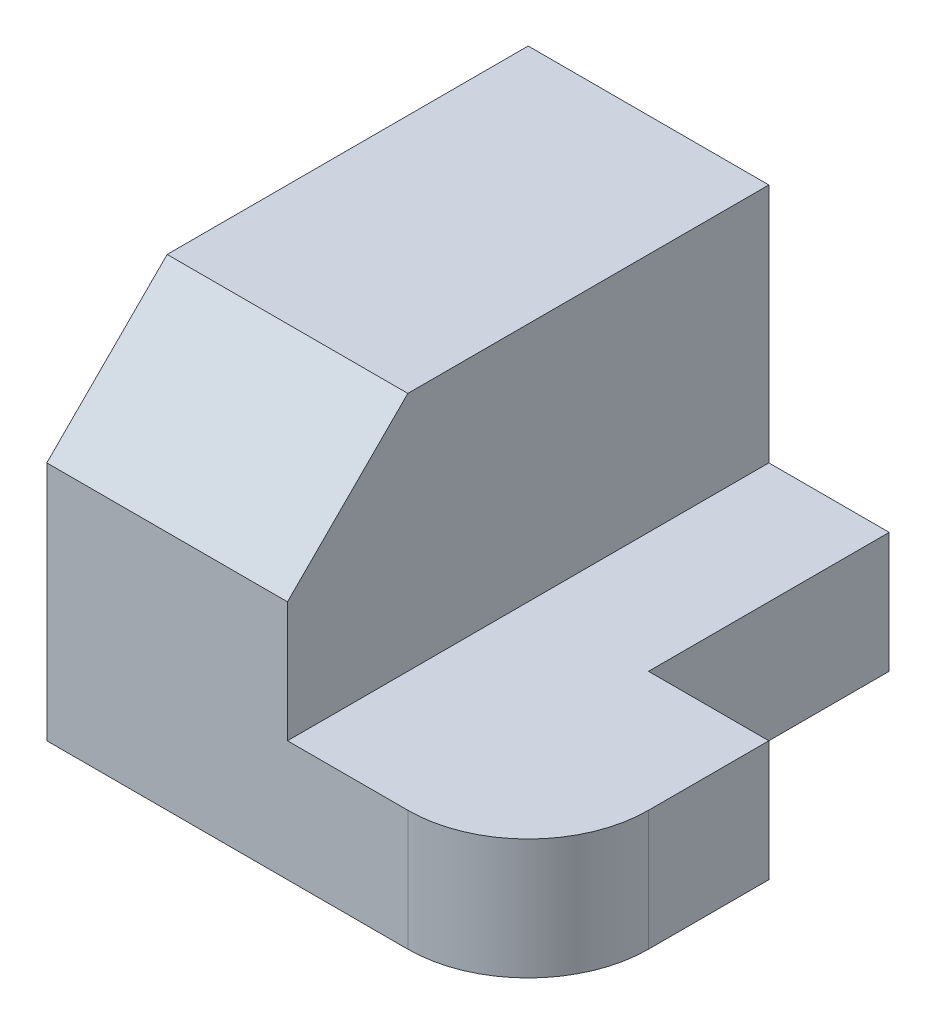
ISO-10303-21;
HEADER;
FILE_DESCRIPTION(('STEP AP214'),'2;1');
FILE_NAME('part.step','',(''),(''),'','','');
FILE_SCHEMA(('AUTOMOTIVE_DESIGN { 1 0 10303 214 1 1 1 1 }'));
ENDSEC;
DATA;
#1=APPLICATION_CONTEXT('core data for automotive mechanical design processes');
#2=APPLICATION_PROTOCOL_DEFINITION('international standard','automotive_design',2000,#1);
#3=PRODUCT_CONTEXT('',#1,'mechanical');
#4=PRODUCT('Part','Part','',(#3));
#5=PRODUCT_RELATED_PRODUCT_CATEGORY('part','',(#4));
#6=PRODUCT_DEFINITION_FORMATION('','',#4);
#7=PRODUCT_DEFINITION_CONTEXT('part definition',#1,'design');
#8=PRODUCT_DEFINITION('design','',#6,#7);
#9=PRODUCT_DEFINITION_SHAPE('','',#8);
#10=(LENGTH_UNIT() NAMED_UNIT(*) SI_UNIT(.MILLI.,.METRE.));
#11=(NAMED_UNIT(*) PLANE_ANGLE_UNIT() SI_UNIT($,.RADIAN.));
#12=(NAMED_UNIT(*) SI_UNIT($,.STERADIAN.) SOLID_ANGLE_UNIT());
#13=UNCERTAINTY_MEASURE_WITH_UNIT(LENGTH_MEASURE(1.E-05),#10,'distance_accuracy_value','');
#14=(GEOMETRIC_REPRESENTATION_CONTEXT(3) GLOBAL_UNCERTAINTY_ASSIGNED_CONTEXT((#13)) GLOBAL_UNIT_ASSIGNED_CONTEXT((#10,
#11,#12)) REPRESENTATION_CONTEXT('',''));
#15=CARTESIAN_POINT('',(0.,0.,0.));
#16=DIRECTION('',(0.,0.,1.));
#17=DIRECTION('',(1.,0.,0.));
#18=AXIS2_PLACEMENT_3D('',#15,#16,#17);
#19=CARTESIAN_POINT('',(-43.7606837606838,30.,25.6410256410256));
#20=DIRECTION('',(0.,0.,-1.));
#21=DIRECTION('',(-1.,0.,0.));
#22=AXIS2_PLACEMENT_3D('',#19,#20,#21);
#23=PLANE('',#22);
#24=DIRECTION('',(0.,1.,0.));
#25=VECTOR('',#24,1.);
#26=CARTESIAN_POINT('',(-23.7606837606837,10.,25.6410256410256));
#27=LINE('',#26,#25);
#28=CARTESIAN_POINT('',(-23.7606837606837,10.,25.6410256410256));
#29=VERTEX_POINT('',#28);
#30=CARTESIAN_POINT('',(-23.7606837606837,20.,25.6410256410256));
#31=VERTEX_POINT('',#30);
#32=EDGE_CURVE('E141',#29,#31,#27,.T.);
#33=ORIENTED_EDGE('',*,*,#32,.T.);
#34=DIRECTION('',(-1.,0.,0.));
#35=VECTOR('',#34,1.);
#36=CARTESIAN_POINT('',(-23.7606837606838,20.,25.6410256410256));
#37=LINE('',#36,#35);
#38=CARTESIAN_POINT('',(-43.7606837606838,20.,25.6410256410256));
#39=VERTEX_POINT('',#38);
#40=EDGE_CURVE('E56',#31,#39,#37,.T.);
#41=ORIENTED_EDGE('',*,*,#40,.T.);
#42=DIRECTION('',(0.,-1.,0.));
#43=VECTOR('',#42,1.);
#44=CARTESIAN_POINT('',(-43.7606837606838,30.,25.6410256410256));
#45=LINE('',#44,#43);
#46=CARTESIAN_POINT('',(-43.7606837606838,0.,25.6410256410256));
#47=VERTEX_POINT('',#46);
#48=EDGE_CURVE('E49',#39,#47,#45,.T.);
#49=ORIENTED_EDGE('',*,*,#48,.T.);
#50=DIRECTION('',(1.,0.,0.));
#51=VECTOR('',#50,1.);
#52=CARTESIAN_POINT('',(-43.7606837606838,0.,25.6410256410256));
#53=LINE('',#52,#51);
#54=CARTESIAN_POINT('',(-13.7606837606838,0.,25.6410256410256));
#55=VERTEX_POINT('',#54);
#56=EDGE_CURVE('E175',#47,#55,#53,.T.);
#57=ORIENTED_EDGE('',*,*,#56,.T.);
#58=DIRECTION('',(0.,-1.,0.));
#59=VECTOR('',#58,1.);
#60=CARTESIAN_POINT('',(-13.7606837606838,30.,25.6410256410256));
#61=LINE('',#60,#59);
#62=CARTESIAN_POINT('',(-13.7606837606838,10.,25.6410256410256));
#63=VERTEX_POINT('',#62);
#64=EDGE_CURVE('E212',#63,#55,#61,.T.);
#65=ORIENTED_EDGE('',*,*,#64,.F.);
#66=DIRECTION('',(1.,0.,0.));
#67=VECTOR('',#66,1.);
#68=CARTESIAN_POINT('',(-43.7606837606838,10.,25.6410256410256));
#69=LINE('',#68,#67);
#70=EDGE_CURVE('E161',#29,#63,#69,.T.);
#71=ORIENTED_EDGE('',*,*,#70,.F.);
#72=EDGE_LOOP('',(#33,#41,#49,#57,#65,#71));
#73=FACE_BOUND('',#72,.T.);
#74=ADVANCED_FACE('F40',(#73),#23,.F.);
#75=CARTESIAN_POINT('',(-13.7606837606838,30.,15.6410256410256));
#76=DIRECTION('',(0.,-1.,0.));
#77=DIRECTION('',(0.,0.,-1.));
#78=AXIS2_PLACEMENT_3D('',#75,#76,#77);
#79=CYLINDRICAL_SURFACE('',#78,10.);
#80=CARTESIAN_POINT('',(-13.7606837606838,10.,15.6410256410256));
#81=DIRECTION('',(0.,1.,0.));
#82=DIRECTION('',(0.,0.,1.));
#83=AXIS2_PLACEMENT_3D('',#80,#81,#82);
#84=CIRCLE('',#83,10.);
#85=CARTESIAN_POINT('',(-3.76068376068375,10.,15.6410256410256));
#86=VERTEX_POINT('',#85);
#87=EDGE_CURVE('E158',#63,#86,#84,.T.);
#88=ORIENTED_EDGE('',*,*,#87,.F.);
#89=ORIENTED_EDGE('',*,*,#64,.T.);
#90=CARTESIAN_POINT('',(-13.7606837606838,0.,15.6410256410256));
#91=DIRECTION('',(0.,1.,0.));
#92=DIRECTION('',(0.,0.,1.));
#93=AXIS2_PLACEMENT_3D('',#90,#91,#92);
#94=CIRCLE('',#93,10.);
#95=CARTESIAN_POINT('',(-3.76068376068375,0.,15.6410256410256));
#96=VERTEX_POINT('',#95);
#97=EDGE_CURVE('E179',#55,#96,#94,.T.);
#98=ORIENTED_EDGE('',*,*,#97,.T.);
#99=DIRECTION('',(0.,-1.,0.));
#100=VECTOR('',#99,1.);
#101=CARTESIAN_POINT('',(-3.76068376068375,30.,15.6410256410256));
#102=LINE('',#101,#100);
#103=EDGE_CURVE('E209',#86,#96,#102,.T.);
#104=ORIENTED_EDGE('',*,*,#103,.F.);
#105=EDGE_LOOP('',(#88,#89,#98,#104));
#106=FACE_BOUND('',#105,.T.);
#107=ADVANCED_FACE('F247',(#106),#79,.T.);
#108=CARTESIAN_POINT('',(-3.76068376068375,30.,15.6410256410256));
#109=DIRECTION('',(-1.,0.,0.));
#110=DIRECTION('',(0.,0.,1.));
#111=AXIS2_PLACEMENT_3D('',#108,#109,#110);
#112=PLANE('',#111);
#113=DIRECTION('',(0.,0.,-1.));
#114=VECTOR('',#113,1.);
#115=CARTESIAN_POINT('',(-3.76068376068375,10.,15.6410256410256));
#116=LINE('',#115,#114);
#117=CARTESIAN_POINT('',(-3.76068376068375,10.,5.64102564102564));
#118=VERTEX_POINT('',#117);
#119=EDGE_CURVE('E155',#86,#118,#116,.T.);
#120=ORIENTED_EDGE('',*,*,#119,.F.);
#121=ORIENTED_EDGE('',*,*,#103,.T.);
#122=DIRECTION('',(0.,0.,-1.));
#123=VECTOR('',#122,1.);
#124=CARTESIAN_POINT('',(-3.76068376068375,0.,15.6410256410256));
#125=LINE('',#124,#123);
#126=CARTESIAN_POINT('',(-3.76068376068375,0.,5.64102564102564));
#127=VERTEX_POINT('',#126);
#128=EDGE_CURVE('E183',#96,#127,#125,.T.);
#129=ORIENTED_EDGE('',*,*,#128,.T.);
#130=DIRECTION('',(0.,-1.,0.));
#131=VECTOR('',#130,1.);
#132=CARTESIAN_POINT('',(-3.76068376068375,30.,5.64102564102564));
#133=LINE('',#132,#131);
#134=EDGE_CURVE('E206',#118,#127,#133,.T.);
#135=ORIENTED_EDGE('',*,*,#134,.F.);
#136=EDGE_LOOP('',(#120,#121,#129,#135));
#137=FACE_BOUND('',#136,.T.);
#138=ADVANCED_FACE('F243',(#137),#112,.F.);
#139=CARTESIAN_POINT('',(-3.76068376068375,30.,5.64102564102564));
#140=DIRECTION('',(0.,0.,1.));
#141=DIRECTION('',(1.,0.,0.));
#142=AXIS2_PLACEMENT_3D('',#139,#140,#141);
#143=PLANE('',#142);
#144=DIRECTION('',(-1.,0.,0.));
#145=VECTOR('',#144,1.);
#146=CARTESIAN_POINT('',(-3.76068376068375,10.,5.64102564102564));
#147=LINE('',#146,#145);
#148=CARTESIAN_POINT('',(-13.7606837606838,10.,5.64102564102564));
#149=VERTEX_POINT('',#148);
#150=EDGE_CURVE('E152',#118,#149,#147,.T.);
#151=ORIENTED_EDGE('',*,*,#150,.F.);
#152=ORIENTED_EDGE('',*,*,#134,.T.);
#153=DIRECTION('',(-1.,0.,0.));
#154=VECTOR('',#153,1.);
#155=CARTESIAN_POINT('',(-3.76068376068375,0.,5.64102564102564));
#156=LINE('',#155,#154);
#157=CARTESIAN_POINT('',(-13.7606837606838,0.,5.64102564102564));
#158=VERTEX_POINT('',#157);
#159=EDGE_CURVE('E187',#127,#158,#156,.T.);
#160=ORIENTED_EDGE('',*,*,#159,.T.);
#161=DIRECTION('',(0.,-1.,0.));
#162=VECTOR('',#161,1.);
#163=CARTESIAN_POINT('',(-13.7606837606838,30.,5.64102564102564));
#164=LINE('',#163,#162);
#165=EDGE_CURVE('E203',#149,#158,#164,.T.);
#166=ORIENTED_EDGE('',*,*,#165,.F.);
#167=EDGE_LOOP('',(#151,#152,#160,#166));
#168=FACE_BOUND('',#167,.T.);
#169=ADVANCED_FACE('F239',(#168),#143,.F.);
#170=CARTESIAN_POINT('',(-13.7606837606838,30.,5.64102564102564));
#171=DIRECTION('',(-1.,0.,0.));
#172=DIRECTION('',(0.,0.,1.));
#173=AXIS2_PLACEMENT_3D('',#170,#171,#172);
#174=PLANE('',#173);
#175=DIRECTION('',(0.,0.,-1.));
#176=VECTOR('',#175,1.);
#177=CARTESIAN_POINT('',(-13.7606837606838,10.,5.64102564102564));
#178=LINE('',#177,#176);
#179=CARTESIAN_POINT('',(-13.7606837606838,10.,-14.3589743589744));
#180=VERTEX_POINT('',#179);
#181=EDGE_CURVE('E147',#149,#180,#178,.T.);
#182=ORIENTED_EDGE('',*,*,#181,.F.);
#183=ORIENTED_EDGE('',*,*,#165,.T.);
#184=DIRECTION('',(0.,0.,-1.));
#185=VECTOR('',#184,1.);
#186=CARTESIAN_POINT('',(-13.7606837606838,0.,5.64102564102564));
#187=LINE('',#186,#185);
#188=CARTESIAN_POINT('',(-13.7606837606838,0.,-14.3589743589744));
#189=VERTEX_POINT('',#188);
#190=EDGE_CURVE('E191',#158,#189,#187,.T.);
#191=ORIENTED_EDGE('',*,*,#190,.T.);
#192=DIRECTION('',(0.,-1.,0.));
#193=VECTOR('',#192,1.);
#194=CARTESIAN_POINT('',(-13.7606837606838,30.,-14.3589743589744));
#195=LINE('',#194,#193);
#196=EDGE_CURVE('E200',#180,#189,#195,.T.);
#197=ORIENTED_EDGE('',*,*,#196,.F.);
#198=EDGE_LOOP('',(#182,#183,#191,#197));
#199=FACE_BOUND('',#198,.T.);
#200=ADVANCED_FACE('F235',(#199),#174,.F.);
#201=CARTESIAN_POINT('',(-13.7606837606838,30.,15.6410256410256));
#202=DIRECTION('',(0.,1.,0.));
#203=DIRECTION('',(0.,0.,1.));
#204=AXIS2_PLACEMENT_3D('',#201,#202,#203);
#205=PLANE('',#204);
#206=DIRECTION('',(-1.,0.,0.));
#207=VECTOR('',#206,1.);
#208=CARTESIAN_POINT('',(-23.7606837606838,30.,15.6410256410256));
#209=LINE('',#208,#207);
#210=CARTESIAN_POINT('',(-23.7606837606838,30.,15.6410256410256));
#211=VERTEX_POINT('',#210);
#212=CARTESIAN_POINT('',(-43.7606837606838,30.,15.6410256410256));
#213=VERTEX_POINT('',#212);
#214=EDGE_CURVE('E117',#211,#213,#209,.T.);
#215=ORIENTED_EDGE('',*,*,#214,.F.);
#216=DIRECTION('',(0.,0.,-1.));
#217=VECTOR('',#216,1.);
#218=CARTESIAN_POINT('',(-23.7606837606838,30.,-14.3589743589744));
#219=LINE('',#218,#217);
#220=CARTESIAN_POINT('',(-23.7606837606838,30.,-14.3589743589744));
#221=VERTEX_POINT('',#220);
#222=EDGE_CURVE('E64',#211,#221,#219,.T.);
#223=ORIENTED_EDGE('',*,*,#222,.T.);
#224=DIRECTION('',(-1.,0.,0.));
#225=VECTOR('',#224,1.);
#226=CARTESIAN_POINT('',(-13.7606837606838,30.,-14.3589743589744));
#227=LINE('',#226,#225);
#228=CARTESIAN_POINT('',(-43.7606837606838,30.,-14.3589743589744));
#229=VERTEX_POINT('',#228);
#230=EDGE_CURVE('E167',#221,#229,#227,.T.);
#231=ORIENTED_EDGE('',*,*,#230,.T.);
#232=DIRECTION('',(0.,0.,1.));
#233=VECTOR('',#232,1.);
#234=CARTESIAN_POINT('',(-43.7606837606838,30.,-14.3589743589744));
#235=LINE('',#234,#233);
#236=EDGE_CURVE('E128',#229,#213,#235,.T.);
#237=ORIENTED_EDGE('',*,*,#236,.T.);
#238=EDGE_LOOP('',(#215,#223,#231,#237));
#239=FACE_BOUND('',#238,.T.);
#240=ADVANCED_FACE('F126',(#239),#205,.T.);
#241=CARTESIAN_POINT('',(-43.7606837606838,30.,-14.3589743589744));
#242=DIRECTION('',(1.,0.,0.));
#243=DIRECTION('',(0.,0.,-1.));
#244=AXIS2_PLACEMENT_3D('',#241,#242,#243);
#245=PLANE('',#244);
#246=ORIENTED_EDGE('',*,*,#48,.F.);
#247=DIRECTION('',(0.,-0.707106781186546,0.707106781186549));
#248=VECTOR('',#247,1.);
#249=CARTESIAN_POINT('',(-43.7606837606838,30.,15.6410256410256));
#250=LINE('',#249,#248);
#251=EDGE_CURVE('E123',#213,#39,#250,.T.);
#252=ORIENTED_EDGE('',*,*,#251,.F.);
#253=ORIENTED_EDGE('',*,*,#236,.F.);
#254=DIRECTION('',(0.,-1.,0.));
#255=VECTOR('',#254,1.);
#256=CARTESIAN_POINT('',(-43.7606837606838,30.,-14.3589743589744));
#257=LINE('',#256,#255);
#258=CARTESIAN_POINT('',(-43.7606837606838,0.,-14.3589743589744));
#259=VERTEX_POINT('',#258);
#260=EDGE_CURVE('E171',#229,#259,#257,.T.);
#261=ORIENTED_EDGE('',*,*,#260,.T.);
#262=DIRECTION('',(0.,0.,1.));
#263=VECTOR('',#262,1.);
#264=CARTESIAN_POINT('',(-43.7606837606838,0.,-14.3589743589744));
#265=LINE('',#264,#263);
#266=EDGE_CURVE('E164',#259,#47,#265,.T.);
#267=ORIENTED_EDGE('',*,*,#266,.T.);
#268=EDGE_LOOP('',(#246,#252,#253,#261,#267));
#269=FACE_BOUND('',#268,.T.);
#270=ADVANCED_FACE('F42',(#269),#245,.F.);
#271=CARTESIAN_POINT('',(-13.7606837606838,30.,-14.3589743589744));
#272=DIRECTION('',(0.,0.,1.));
#273=DIRECTION('',(1.,0.,0.));
#274=AXIS2_PLACEMENT_3D('',#271,#272,#273);
#275=PLANE('',#274);
#276=DIRECTION('',(0.,1.,0.));
#277=VECTOR('',#276,1.);
#278=CARTESIAN_POINT('',(-23.7606837606838,10.,-14.3589743589744));
#279=LINE('',#278,#277);
#280=CARTESIAN_POINT('',(-23.7606837606838,10.,-14.3589743589744));
#281=VERTEX_POINT('',#280);
#282=EDGE_CURVE('E134',#281,#221,#279,.T.);
#283=ORIENTED_EDGE('',*,*,#282,.F.);
#284=DIRECTION('',(-1.,0.,0.));
#285=VECTOR('',#284,1.);
#286=CARTESIAN_POINT('',(-13.7606837606838,10.,-14.3589743589744));
#287=LINE('',#286,#285);
#288=EDGE_CURVE('E12',#180,#281,#287,.T.);
#289=ORIENTED_EDGE('',*,*,#288,.F.);
#290=ORIENTED_EDGE('',*,*,#196,.T.);
#291=DIRECTION('',(-1.,0.,0.));
#292=VECTOR('',#291,1.);
#293=CARTESIAN_POINT('',(-13.7606837606838,0.,-14.3589743589744));
#294=LINE('',#293,#292);
#295=EDGE_CURVE('E168',#189,#259,#294,.T.);
#296=ORIENTED_EDGE('',*,*,#295,.T.);
#297=ORIENTED_EDGE('',*,*,#260,.F.);
#298=ORIENTED_EDGE('',*,*,#230,.F.);
#299=EDGE_LOOP('',(#283,#289,#290,#296,#297,#298));
#300=FACE_BOUND('',#299,.T.);
#301=ADVANCED_FACE('F228',(#300),#275,.F.);
#302=CARTESIAN_POINT('',(-13.7606837606838,0.,15.6410256410256));
#303=DIRECTION('',(0.,1.,0.));
#304=DIRECTION('',(0.,0.,1.));
#305=AXIS2_PLACEMENT_3D('',#302,#303,#304);
#306=PLANE('',#305);
#307=ORIENTED_EDGE('',*,*,#266,.F.);
#308=ORIENTED_EDGE('',*,*,#295,.F.);
#309=ORIENTED_EDGE('',*,*,#190,.F.);
#310=ORIENTED_EDGE('',*,*,#159,.F.);
#311=ORIENTED_EDGE('',*,*,#128,.F.);
#312=ORIENTED_EDGE('',*,*,#97,.F.);
#313=ORIENTED_EDGE('',*,*,#56,.F.);
#314=EDGE_LOOP('',(#307,#308,#309,#310,#311,#312,#313));
#315=FACE_BOUND('',#314,.T.);
#316=ADVANCED_FACE('F223',(#315),#306,.F.);
#317=CARTESIAN_POINT('',(-23.7606837606838,10.,5.64102564102564));
#318=DIRECTION('',(0.,1.,0.));
#319=DIRECTION('',(0.,0.,1.));
#320=AXIS2_PLACEMENT_3D('',#317,#318,#319);
#321=PLANE('',#320);
#322=ORIENTED_EDGE('',*,*,#70,.T.);
#323=ORIENTED_EDGE('',*,*,#87,.T.);
#324=ORIENTED_EDGE('',*,*,#119,.T.);
#325=ORIENTED_EDGE('',*,*,#150,.T.);
#326=ORIENTED_EDGE('',*,*,#181,.T.);
#327=ORIENTED_EDGE('',*,*,#288,.T.);
#328=DIRECTION('',(0.,0.,-1.));
#329=VECTOR('',#328,1.);
#330=CARTESIAN_POINT('',(-23.7606837606838,10.,-14.3589743589744));
#331=LINE('',#330,#329);
#332=EDGE_CURVE('E137',#29,#281,#331,.T.);
#333=ORIENTED_EDGE('',*,*,#332,.F.);
#334=EDGE_LOOP('',(#322,#323,#324,#325,#326,#327,#333));
#335=FACE_BOUND('',#334,.T.);
#336=ADVANCED_FACE('F250',(#335),#321,.T.);
#337=CARTESIAN_POINT('',(-23.7606837606838,10.,-14.3589743589744));
#338=DIRECTION('',(1.,0.,0.));
#339=DIRECTION('',(0.,0.,-1.));
#340=AXIS2_PLACEMENT_3D('',#337,#338,#339);
#341=PLANE('',#340);
#342=DIRECTION('',(0.,-0.707106781186546,0.707106781186549));
#343=VECTOR('',#342,1.);
#344=CARTESIAN_POINT('',(-23.7606837606838,30.,15.6410256410256));
#345=LINE('',#344,#343);
#346=EDGE_CURVE('E115',#211,#31,#345,.T.);
#347=ORIENTED_EDGE('',*,*,#346,.T.);
#348=ORIENTED_EDGE('',*,*,#32,.F.);
#349=ORIENTED_EDGE('',*,*,#332,.T.);
#350=ORIENTED_EDGE('',*,*,#282,.T.);
#351=ORIENTED_EDGE('',*,*,#222,.F.);
#352=EDGE_LOOP('',(#347,#348,#349,#350,#351));
#353=FACE_BOUND('',#352,.T.);
#354=ADVANCED_FACE('F131',(#353),#341,.T.);
#355=CARTESIAN_POINT('',(-23.7606837606838,30.,15.6410256410256));
#356=DIRECTION('',(0.,-0.707106781186549,-0.707106781186546));
#357=DIRECTION('',(0.,0.707106781186546,-0.707106781186549));
#358=AXIS2_PLACEMENT_3D('',#355,#356,#357);
#359=PLANE('',#358);
#360=ORIENTED_EDGE('',*,*,#251,.T.);
#361=ORIENTED_EDGE('',*,*,#40,.F.);
#362=ORIENTED_EDGE('',*,*,#346,.F.);
#363=ORIENTED_EDGE('',*,*,#214,.T.);
#364=EDGE_LOOP('',(#360,#361,#362,#363));
#365=FACE_BOUND('',#364,.T.);
#366=ADVANCED_FACE('F116',(#365),#359,.F.);
#367=CLOSED_SHELL('',(#74,#107,#138,#169,#200,#240,#270,#301,#316,#336,#354,#366));
#368=MANIFOLD_SOLID_BREP('B2',#367);
#369=ADVANCED_BREP_SHAPE_REPRESENTATION('',(#18,#368),#14);
#370=SHAPE_DEFINITION_REPRESENTATION(#9,#369);
ENDSEC;
END-ISO-10303-21;
